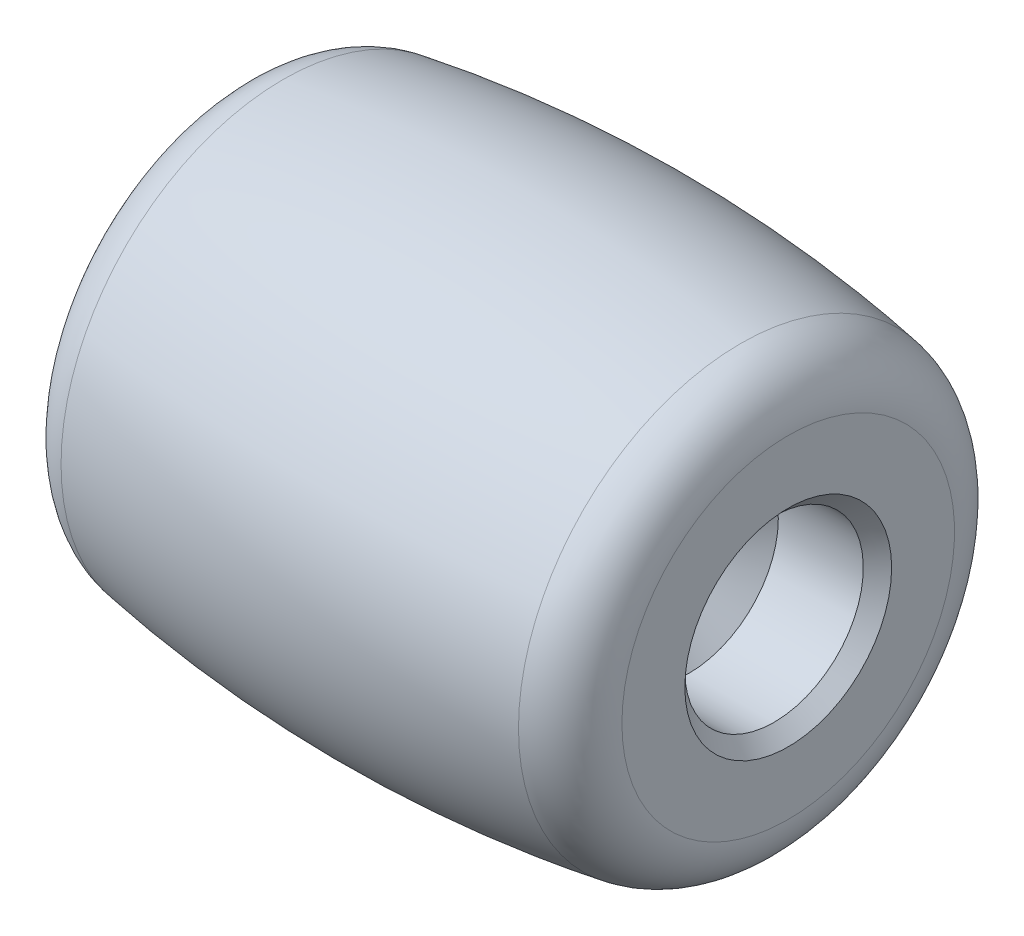
ISO-10303-21;
HEADER;
FILE_DESCRIPTION(('STEP AP214'),'2;1');
FILE_NAME('part.step','',(''),(''),'','','');
FILE_SCHEMA(('AUTOMOTIVE_DESIGN { 1 0 10303 214 1 1 1 1 }'));
ENDSEC;
DATA;
#1=APPLICATION_CONTEXT('core data for automotive mechanical design processes');
#2=APPLICATION_PROTOCOL_DEFINITION('international standard','automotive_design',2000,#1);
#3=PRODUCT_CONTEXT('',#1,'mechanical');
#4=PRODUCT('Part','Part','',(#3));
#5=PRODUCT_RELATED_PRODUCT_CATEGORY('part','',(#4));
#6=PRODUCT_DEFINITION_FORMATION('','',#4);
#7=PRODUCT_DEFINITION_CONTEXT('part definition',#1,'design');
#8=PRODUCT_DEFINITION('design','',#6,#7);
#9=PRODUCT_DEFINITION_SHAPE('','',#8);
#10=(LENGTH_UNIT() NAMED_UNIT(*) SI_UNIT(.MILLI.,.METRE.));
#11=(NAMED_UNIT(*) PLANE_ANGLE_UNIT() SI_UNIT($,.RADIAN.));
#12=(NAMED_UNIT(*) SI_UNIT($,.STERADIAN.) SOLID_ANGLE_UNIT());
#13=UNCERTAINTY_MEASURE_WITH_UNIT(LENGTH_MEASURE(1.E-05),#10,'distance_accuracy_value','');
#14=(GEOMETRIC_REPRESENTATION_CONTEXT(3) GLOBAL_UNCERTAINTY_ASSIGNED_CONTEXT((#13)) GLOBAL_UNIT_ASSIGNED_CONTEXT((#10,
#11,#12)) REPRESENTATION_CONTEXT('',''));
#15=CARTESIAN_POINT('',(0.,0.,0.));
#16=DIRECTION('',(0.,0.,1.));
#17=DIRECTION('',(1.,0.,0.));
#18=AXIS2_PLACEMENT_3D('',#15,#16,#17);
#19=CARTESIAN_POINT('',(0.,0.,0.));
#20=DIRECTION('',(-1.,0.,0.));
#21=DIRECTION('',(0.,0.,1.));
#22=AXIS2_PLACEMENT_3D('',#19,#20,#21);
#23=DEGENERATE_TOROIDAL_SURFACE('',#22,41.5,50.,.F.);
#24=CARTESIAN_POINT('',(-8.07291666666667,0.,0.));
#25=DIRECTION('',(1.,0.,0.));
#26=DIRECTION('',(0.,0.,-1.));
#27=AXIS2_PLACEMENT_3D('',#24,#25,#26);
#28=CIRCLE('',#27,7.8439764965599);
#29=CARTESIAN_POINT('',(-8.07291666666667,0.,-7.8439764965599));
#30=VERTEX_POINT('',#29);
#31=EDGE_CURVE('E70',#30,#30,#28,.T.);
#32=ORIENTED_EDGE('',*,*,#31,.T.);
#33=EDGE_LOOP('',(#32));
#34=FACE_BOUND('',#33,.T.);
#35=CARTESIAN_POINT('',(8.07291666666667,0.,0.));
#36=DIRECTION('',(-1.,0.,0.));
#37=DIRECTION('',(0.,0.,1.));
#38=AXIS2_PLACEMENT_3D('',#35,#36,#37);
#39=CIRCLE('',#38,7.84397649655991);
#40=CARTESIAN_POINT('',(8.07291666666667,0.,7.84397649655991));
#41=VERTEX_POINT('',#40);
#42=EDGE_CURVE('E85',#41,#41,#39,.T.);
#43=ORIENTED_EDGE('',*,*,#42,.T.);
#44=EDGE_LOOP('',(#43));
#45=FACE_BOUND('',#44,.T.);
#46=ADVANCED_FACE('F43',(#34,#45),#23,.F.);
#47=CARTESIAN_POINT('',(0.,0.,0.));
#48=DIRECTION('',(-1.,0.,0.));
#49=DIRECTION('',(0.,0.,1.));
#50=AXIS2_PLACEMENT_3D('',#47,#48,#49);
#51=CYLINDRICAL_SURFACE('',#50,1.75);
#52=CARTESIAN_POINT('',(5.08333333333335,0.,0.));
#53=DIRECTION('',(1.,0.,0.));
#54=DIRECTION('',(0.,1.,0.));
#55=AXIS2_PLACEMENT_3D('',#52,#53,#54);
#56=CIRCLE('',#55,1.75);
#57=CARTESIAN_POINT('',(5.08333333333335,1.75,0.));
#58=VERTEX_POINT('',#57);
#59=EDGE_CURVE('E10',#58,#58,#56,.T.);
#60=ORIENTED_EDGE('',*,*,#59,.T.);
#61=EDGE_LOOP('',(#60));
#62=FACE_BOUND('',#61,.T.);
#63=CARTESIAN_POINT('',(-5.07000000000002,0.,0.));
#64=DIRECTION('',(-1.,0.,0.));
#65=DIRECTION('',(0.,-1.,0.));
#66=AXIS2_PLACEMENT_3D('',#63,#64,#65);
#67=CIRCLE('',#66,1.75);
#68=CARTESIAN_POINT('',(-5.07000000000002,-1.75,0.));
#69=VERTEX_POINT('',#68);
#70=EDGE_CURVE('E51',#69,#69,#67,.T.);
#71=ORIENTED_EDGE('',*,*,#70,.T.);
#72=EDGE_LOOP('',(#71));
#73=FACE_BOUND('',#72,.T.);
#74=ADVANCED_FACE('F111',(#62,#73),#51,.F.);
#75=CARTESIAN_POINT('',(9.75,0.,0.));
#76=DIRECTION('',(-1.,0.,0.));
#77=DIRECTION('',(0.,0.,1.));
#78=AXIS2_PLACEMENT_3D('',#75,#76,#77);
#79=PLANE('',#78);
#80=CARTESIAN_POINT('',(9.75,0.,0.));
#81=DIRECTION('',(-1.,0.,0.));
#82=DIRECTION('',(0.,0.,1.));
#83=AXIS2_PLACEMENT_3D('',#80,#81,#82);
#84=CIRCLE('',#83,3.65);
#85=CARTESIAN_POINT('',(9.75,0.,3.65));
#86=VERTEX_POINT('',#85);
#87=EDGE_CURVE('E76',#86,#86,#84,.T.);
#88=ORIENTED_EDGE('',*,*,#87,.T.);
#89=EDGE_LOOP('',(#88));
#90=FACE_BOUND('',#89,.T.);
#91=CARTESIAN_POINT('',(9.75,0.,0.));
#92=DIRECTION('',(-1.,0.,0.));
#93=DIRECTION('',(0.,0.,1.));
#94=AXIS2_PLACEMENT_3D('',#91,#92,#93);
#95=CIRCLE('',#94,5.87021743669751);
#96=CARTESIAN_POINT('',(9.75,0.,5.87021743669751));
#97=VERTEX_POINT('',#96);
#98=EDGE_CURVE('E82',#97,#97,#95,.F.);
#99=ORIENTED_EDGE('',*,*,#98,.T.);
#100=EDGE_LOOP('',(#99));
#101=FACE_BOUND('',#100,.T.);
#102=ADVANCED_FACE('F104',(#90,#101),#79,.F.);
#103=CARTESIAN_POINT('',(3.75,0.,0.));
#104=DIRECTION('',(1.,0.,0.));
#105=DIRECTION('',(0.,1.,0.));
#106=AXIS2_PLACEMENT_3D('',#103,#104,#105);
#107=CYLINDRICAL_SURFACE('',#106,3.15);
#108=CARTESIAN_POINT('',(6.25000000000002,0.,0.));
#109=DIRECTION('',(-1.,0.,0.));
#110=DIRECTION('',(0.,-1.,0.));
#111=AXIS2_PLACEMENT_3D('',#108,#109,#110);
#112=CIRCLE('',#111,3.15);
#113=CARTESIAN_POINT('',(6.25000000000002,-3.15,0.));
#114=VERTEX_POINT('',#113);
#115=EDGE_CURVE('E55',#114,#114,#112,.T.);
#116=ORIENTED_EDGE('',*,*,#115,.T.);
#117=EDGE_LOOP('',(#116));
#118=FACE_BOUND('',#117,.T.);
#119=CARTESIAN_POINT('',(9.25,0.,0.));
#120=DIRECTION('',(-1.,0.,0.));
#121=DIRECTION('',(0.,-1.,0.));
#122=AXIS2_PLACEMENT_3D('',#119,#120,#121);
#123=CIRCLE('',#122,3.15);
#124=CARTESIAN_POINT('',(9.25,-3.15,0.));
#125=VERTEX_POINT('',#124);
#126=EDGE_CURVE('E79',#125,#125,#123,.F.);
#127=ORIENTED_EDGE('',*,*,#126,.T.);
#128=EDGE_LOOP('',(#127));
#129=FACE_BOUND('',#128,.T.);
#130=ADVANCED_FACE('F93',(#118,#129),#107,.F.);
#131=CARTESIAN_POINT('',(7.75,0.,0.));
#132=DIRECTION('',(-1.,0.,0.));
#133=DIRECTION('',(0.,0.,1.));
#134=AXIS2_PLACEMENT_3D('',#131,#132,#133);
#135=TOROIDAL_SURFACE('',#134,5.87021743669751,2.);
#136=ORIENTED_EDGE('',*,*,#98,.F.);
#137=EDGE_LOOP('',(#136));
#138=FACE_BOUND('',#137,.T.);
#139=ORIENTED_EDGE('',*,*,#42,.F.);
#140=EDGE_LOOP('',(#139));
#141=FACE_BOUND('',#140,.T.);
#142=ADVANCED_FACE('F90',(#138,#141),#135,.T.);
#143=CARTESIAN_POINT('',(-9.75,0.,0.));
#144=DIRECTION('',(1.,0.,0.));
#145=DIRECTION('',(0.,0.,1.));
#146=AXIS2_PLACEMENT_3D('',#143,#144,#145);
#147=PLANE('',#146);
#148=CARTESIAN_POINT('',(-9.75,0.,0.));
#149=DIRECTION('',(1.,0.,0.));
#150=DIRECTION('',(0.,0.,-1.));
#151=AXIS2_PLACEMENT_3D('',#148,#149,#150);
#152=CIRCLE('',#151,3.65000000000001);
#153=CARTESIAN_POINT('',(-9.75,0.,-3.65000000000001));
#154=VERTEX_POINT('',#153);
#155=EDGE_CURVE('E67',#154,#154,#152,.T.);
#156=ORIENTED_EDGE('',*,*,#155,.T.);
#157=EDGE_LOOP('',(#156));
#158=FACE_BOUND('',#157,.T.);
#159=CARTESIAN_POINT('',(-9.75,0.,0.));
#160=DIRECTION('',(1.,0.,0.));
#161=DIRECTION('',(0.,0.,-1.));
#162=AXIS2_PLACEMENT_3D('',#159,#160,#161);
#163=CIRCLE('',#162,5.8702174366975);
#164=CARTESIAN_POINT('',(-9.75,0.,-5.8702174366975));
#165=VERTEX_POINT('',#164);
#166=EDGE_CURVE('E73',#165,#165,#163,.F.);
#167=ORIENTED_EDGE('',*,*,#166,.T.);
#168=EDGE_LOOP('',(#167));
#169=FACE_BOUND('',#168,.T.);
#170=ADVANCED_FACE('F92',(#158,#169),#147,.F.);
#171=CARTESIAN_POINT('',(9.25,0.,0.));
#172=DIRECTION('',(1.,0.,0.));
#173=DIRECTION('',(0.,1.,0.));
#174=AXIS2_PLACEMENT_3D('',#171,#172,#173);
#175=CONICAL_SURFACE('',#174,3.15,0.785398163397452);
#176=ORIENTED_EDGE('',*,*,#87,.F.);
#177=EDGE_LOOP('',(#176));
#178=FACE_BOUND('',#177,.T.);
#179=ORIENTED_EDGE('',*,*,#126,.F.);
#180=EDGE_LOOP('',(#179));
#181=FACE_BOUND('',#180,.T.);
#182=ADVANCED_FACE('F100',(#178,#181),#175,.F.);
#183=CARTESIAN_POINT('',(-3.75,0.,0.));
#184=DIRECTION('',(-1.,0.,0.));
#185=DIRECTION('',(0.,1.,0.));
#186=AXIS2_PLACEMENT_3D('',#183,#184,#185);
#187=CYLINDRICAL_SURFACE('',#186,3.15);
#188=CARTESIAN_POINT('',(-6.75000000000002,0.,0.));
#189=DIRECTION('',(1.,0.,0.));
#190=DIRECTION('',(0.,1.,0.));
#191=AXIS2_PLACEMENT_3D('',#188,#189,#190);
#192=CIRCLE('',#191,3.15);
#193=CARTESIAN_POINT('',(-6.75000000000002,3.15,0.));
#194=VERTEX_POINT('',#193);
#195=EDGE_CURVE('E59',#194,#194,#192,.T.);
#196=ORIENTED_EDGE('',*,*,#195,.T.);
#197=EDGE_LOOP('',(#196));
#198=FACE_BOUND('',#197,.T.);
#199=CARTESIAN_POINT('',(-9.24999999999999,0.,0.));
#200=DIRECTION('',(1.,0.,0.));
#201=DIRECTION('',(0.,1.,0.));
#202=AXIS2_PLACEMENT_3D('',#199,#200,#201);
#203=CIRCLE('',#202,3.15);
#204=CARTESIAN_POINT('',(-9.24999999999999,3.15,0.));
#205=VERTEX_POINT('',#204);
#206=EDGE_CURVE('E64',#205,#205,#203,.F.);
#207=ORIENTED_EDGE('',*,*,#206,.T.);
#208=EDGE_LOOP('',(#207));
#209=FACE_BOUND('',#208,.T.);
#210=ADVANCED_FACE('F121',(#198,#209),#187,.F.);
#211=CARTESIAN_POINT('',(-7.75,0.,0.));
#212=DIRECTION('',(1.,0.,0.));
#213=DIRECTION('',(0.,0.,-1.));
#214=AXIS2_PLACEMENT_3D('',#211,#212,#213);
#215=TOROIDAL_SURFACE('',#214,5.8702174366975,2.);
#216=ORIENTED_EDGE('',*,*,#31,.F.);
#217=EDGE_LOOP('',(#216));
#218=FACE_BOUND('',#217,.T.);
#219=ORIENTED_EDGE('',*,*,#166,.F.);
#220=EDGE_LOOP('',(#219));
#221=FACE_BOUND('',#220,.T.);
#222=ADVANCED_FACE('F123',(#218,#221),#215,.T.);
#223=CARTESIAN_POINT('',(-9.75,0.,0.));
#224=DIRECTION('',(-1.,0.,0.));
#225=DIRECTION('',(0.,-1.,0.));
#226=AXIS2_PLACEMENT_3D('',#223,#224,#225);
#227=CONICAL_SURFACE('',#226,3.65000000000001,0.785398163397453);
#228=ORIENTED_EDGE('',*,*,#206,.F.);
#229=EDGE_LOOP('',(#228));
#230=FACE_BOUND('',#229,.T.);
#231=ORIENTED_EDGE('',*,*,#155,.F.);
#232=EDGE_LOOP('',(#231));
#233=FACE_BOUND('',#232,.T.);
#234=ADVANCED_FACE('F129',(#230,#233),#227,.F.);
#235=CARTESIAN_POINT('',(-6.75000000000002,0.,0.));
#236=DIRECTION('',(-1.,0.,0.));
#237=DIRECTION('',(0.,-1.,0.));
#238=AXIS2_PLACEMENT_3D('',#235,#236,#237);
#239=CONICAL_SURFACE('',#238,3.15,0.694738276196704);
#240=ORIENTED_EDGE('',*,*,#70,.F.);
#241=EDGE_LOOP('',(#240));
#242=FACE_BOUND('',#241,.T.);
#243=ORIENTED_EDGE('',*,*,#195,.F.);
#244=EDGE_LOOP('',(#243));
#245=FACE_BOUND('',#244,.T.);
#246=ADVANCED_FACE('F139',(#242,#245),#239,.F.);
#247=CARTESIAN_POINT('',(3.75,0.,0.));
#248=DIRECTION('',(1.,0.,0.));
#249=DIRECTION('',(0.,1.,0.));
#250=AXIS2_PLACEMENT_3D('',#247,#248,#249);
#251=CONICAL_SURFACE('',#250,0.149999999999983,0.876058050598192);
#252=ORIENTED_EDGE('',*,*,#115,.F.);
#253=EDGE_LOOP('',(#252));
#254=FACE_BOUND('',#253,.T.);
#255=ORIENTED_EDGE('',*,*,#59,.F.);
#256=EDGE_LOOP('',(#255));
#257=FACE_BOUND('',#256,.T.);
#258=ADVANCED_FACE('F46',(#254,#257),#251,.F.);
#259=CLOSED_SHELL('',(#46,#74,#102,#130,#142,#170,#182,#210,#222,#234,#246,#258));
#260=MANIFOLD_SOLID_BREP('B2',#259);
#261=ADVANCED_BREP_SHAPE_REPRESENTATION('',(#18,#260),#14);
#262=SHAPE_DEFINITION_REPRESENTATION(#9,#261);
ENDSEC;
END-ISO-10303-21;
